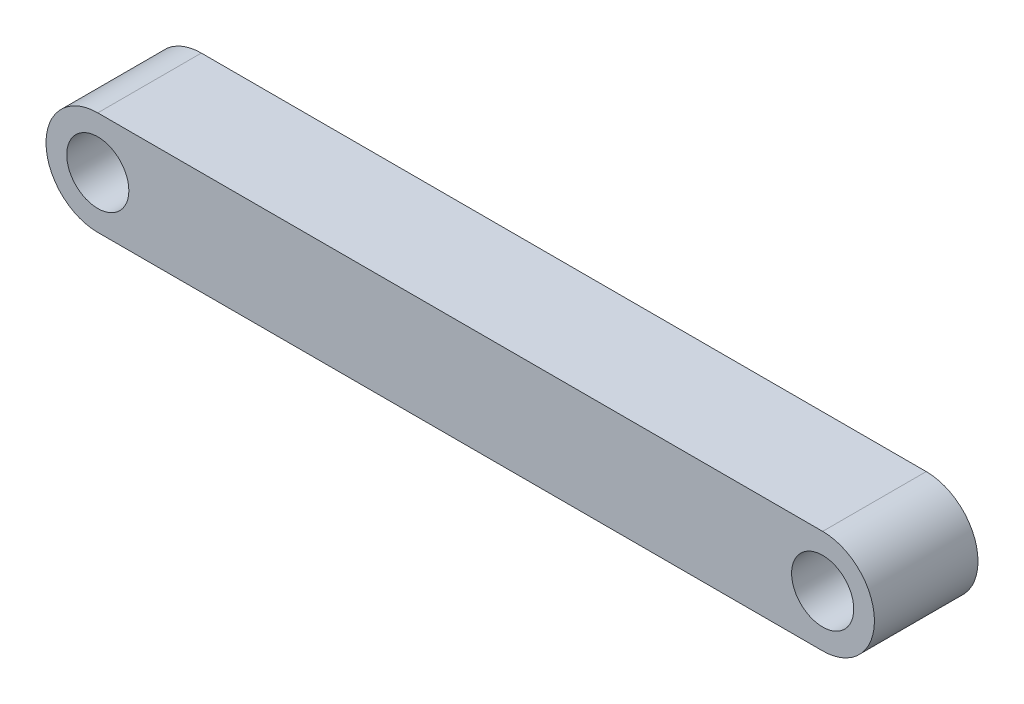
ISO-10303-21;
HEADER;
FILE_DESCRIPTION(('STEP AP214'),'2;1');
FILE_NAME('part.step','',(''),(''),'','','');
FILE_SCHEMA(('AUTOMOTIVE_DESIGN { 1 0 10303 214 1 1 1 1 }'));
ENDSEC;
DATA;
#1=APPLICATION_CONTEXT('core data for automotive mechanical design processes');
#2=APPLICATION_PROTOCOL_DEFINITION('international standard','automotive_design',2000,#1);
#3=PRODUCT_CONTEXT('',#1,'mechanical');
#4=PRODUCT('Part','Part','',(#3));
#5=PRODUCT_RELATED_PRODUCT_CATEGORY('part','',(#4));
#6=PRODUCT_DEFINITION_FORMATION('','',#4);
#7=PRODUCT_DEFINITION_CONTEXT('part definition',#1,'design');
#8=PRODUCT_DEFINITION('design','',#6,#7);
#9=PRODUCT_DEFINITION_SHAPE('','',#8);
#10=(LENGTH_UNIT() NAMED_UNIT(*) SI_UNIT(.MILLI.,.METRE.));
#11=(NAMED_UNIT(*) PLANE_ANGLE_UNIT() SI_UNIT($,.RADIAN.));
#12=(NAMED_UNIT(*) SI_UNIT($,.STERADIAN.) SOLID_ANGLE_UNIT());
#13=UNCERTAINTY_MEASURE_WITH_UNIT(LENGTH_MEASURE(1.E-05),#10,'distance_accuracy_value','');
#14=(GEOMETRIC_REPRESENTATION_CONTEXT(3) GLOBAL_UNCERTAINTY_ASSIGNED_CONTEXT((#13)) GLOBAL_UNIT_ASSIGNED_CONTEXT((#10,
#11,#12)) REPRESENTATION_CONTEXT('',''));
#15=CARTESIAN_POINT('',(0.,0.,0.));
#16=DIRECTION('',(0.,0.,1.));
#17=DIRECTION('',(1.,0.,0.));
#18=AXIS2_PLACEMENT_3D('',#15,#16,#17);
#19=CARTESIAN_POINT('',(-70.,0.,20.));
#20=DIRECTION('',(0.,0.,-1.));
#21=DIRECTION('',(-1.,0.,0.));
#22=AXIS2_PLACEMENT_3D('',#19,#20,#21);
#23=CYLINDRICAL_SURFACE('',#22,10.);
#24=CARTESIAN_POINT('',(-70.,0.,0.));
#25=DIRECTION('',(0.,0.,1.));
#26=DIRECTION('',(1.,0.,0.));
#27=AXIS2_PLACEMENT_3D('',#24,#25,#26);
#28=CIRCLE('',#27,10.);
#29=CARTESIAN_POINT('',(-70.,9.99999999999999,0.));
#30=VERTEX_POINT('',#29);
#31=CARTESIAN_POINT('',(-70.,-10.,0.));
#32=VERTEX_POINT('',#31);
#33=EDGE_CURVE('E99',#30,#32,#28,.T.);
#34=ORIENTED_EDGE('',*,*,#33,.T.);
#35=DIRECTION('',(0.,0.,-1.));
#36=VECTOR('',#35,1.);
#37=CARTESIAN_POINT('',(-70.,-10.,20.));
#38=LINE('',#37,#36);
#39=CARTESIAN_POINT('',(-70.,-10.,20.));
#40=VERTEX_POINT('',#39);
#41=EDGE_CURVE('E11',#40,#32,#38,.T.);
#42=ORIENTED_EDGE('',*,*,#41,.F.);
#43=CARTESIAN_POINT('',(-70.,0.,20.));
#44=DIRECTION('',(0.,0.,1.));
#45=DIRECTION('',(1.,0.,0.));
#46=AXIS2_PLACEMENT_3D('',#43,#44,#45);
#47=CIRCLE('',#46,10.);
#48=CARTESIAN_POINT('',(-70.,9.99999999999999,20.));
#49=VERTEX_POINT('',#48);
#50=EDGE_CURVE('E87',#49,#40,#47,.T.);
#51=ORIENTED_EDGE('',*,*,#50,.F.);
#52=DIRECTION('',(0.,0.,-1.));
#53=VECTOR('',#52,1.);
#54=CARTESIAN_POINT('',(-70.,9.99999999999999,20.));
#55=LINE('',#54,#53);
#56=EDGE_CURVE('E95',#49,#30,#55,.T.);
#57=ORIENTED_EDGE('',*,*,#56,.T.);
#58=EDGE_LOOP('',(#34,#42,#51,#57));
#59=FACE_BOUND('',#58,.T.);
#60=ADVANCED_FACE('F36',(#59),#23,.T.);
#61=CARTESIAN_POINT('',(70.,-9.99999999999999,20.));
#62=DIRECTION('',(0.,1.,0.));
#63=DIRECTION('',(-1.,0.,0.));
#64=AXIS2_PLACEMENT_3D('',#61,#62,#63);
#65=PLANE('',#64);
#66=DIRECTION('',(1.,0.,0.));
#67=VECTOR('',#66,1.);
#68=CARTESIAN_POINT('',(70.,-9.99999999999999,0.));
#69=LINE('',#68,#67);
#70=CARTESIAN_POINT('',(70.,-9.99999999999999,0.));
#71=VERTEX_POINT('',#70);
#72=EDGE_CURVE('E91',#32,#71,#69,.T.);
#73=ORIENTED_EDGE('',*,*,#72,.T.);
#74=DIRECTION('',(0.,0.,-1.));
#75=VECTOR('',#74,1.);
#76=CARTESIAN_POINT('',(70.,-9.99999999999999,20.));
#77=LINE('',#76,#75);
#78=CARTESIAN_POINT('',(70.,-9.99999999999999,20.));
#79=VERTEX_POINT('',#78);
#80=EDGE_CURVE('E44',#79,#71,#77,.T.);
#81=ORIENTED_EDGE('',*,*,#80,.F.);
#82=DIRECTION('',(1.,0.,0.));
#83=VECTOR('',#82,1.);
#84=CARTESIAN_POINT('',(70.,-9.99999999999999,20.));
#85=LINE('',#84,#83);
#86=EDGE_CURVE('E82',#40,#79,#85,.T.);
#87=ORIENTED_EDGE('',*,*,#86,.F.);
#88=ORIENTED_EDGE('',*,*,#41,.T.);
#89=EDGE_LOOP('',(#73,#81,#87,#88));
#90=FACE_BOUND('',#89,.T.);
#91=ADVANCED_FACE('F90',(#90),#65,.F.);
#92=CARTESIAN_POINT('',(70.,0.,20.));
#93=DIRECTION('',(0.,0.,-1.));
#94=DIRECTION('',(-1.,0.,0.));
#95=AXIS2_PLACEMENT_3D('',#92,#93,#94);
#96=CYLINDRICAL_SURFACE('',#95,10.);
#97=CARTESIAN_POINT('',(70.,0.,0.));
#98=DIRECTION('',(0.,0.,1.));
#99=DIRECTION('',(-1.,0.,0.));
#100=AXIS2_PLACEMENT_3D('',#97,#98,#99);
#101=CIRCLE('',#100,10.);
#102=CARTESIAN_POINT('',(70.,10.,0.));
#103=VERTEX_POINT('',#102);
#104=EDGE_CURVE('E69',#71,#103,#101,.T.);
#105=ORIENTED_EDGE('',*,*,#104,.T.);
#106=DIRECTION('',(0.,0.,-1.));
#107=VECTOR('',#106,1.);
#108=CARTESIAN_POINT('',(70.,10.,20.));
#109=LINE('',#108,#107);
#110=CARTESIAN_POINT('',(70.,10.,20.));
#111=VERTEX_POINT('',#110);
#112=EDGE_CURVE('E92',#111,#103,#109,.T.);
#113=ORIENTED_EDGE('',*,*,#112,.F.);
#114=CARTESIAN_POINT('',(70.,0.,20.));
#115=DIRECTION('',(0.,0.,1.));
#116=DIRECTION('',(-1.,0.,0.));
#117=AXIS2_PLACEMENT_3D('',#114,#115,#116);
#118=CIRCLE('',#117,10.);
#119=EDGE_CURVE('E85',#79,#111,#118,.T.);
#120=ORIENTED_EDGE('',*,*,#119,.F.);
#121=ORIENTED_EDGE('',*,*,#80,.T.);
#122=EDGE_LOOP('',(#105,#113,#120,#121));
#123=FACE_BOUND('',#122,.T.);
#124=ADVANCED_FACE('F93',(#123),#96,.T.);
#125=CARTESIAN_POINT('',(70.,10.,20.));
#126=DIRECTION('',(0.,-1.,0.));
#127=DIRECTION('',(1.,0.,0.));
#128=AXIS2_PLACEMENT_3D('',#125,#126,#127);
#129=PLANE('',#128);
#130=DIRECTION('',(-1.,0.,0.));
#131=VECTOR('',#130,1.);
#132=CARTESIAN_POINT('',(70.,10.,0.));
#133=LINE('',#132,#131);
#134=EDGE_CURVE('E75',#103,#30,#133,.T.);
#135=ORIENTED_EDGE('',*,*,#134,.T.);
#136=ORIENTED_EDGE('',*,*,#56,.F.);
#137=DIRECTION('',(-1.,0.,0.));
#138=VECTOR('',#137,1.);
#139=CARTESIAN_POINT('',(70.,10.,20.));
#140=LINE('',#139,#138);
#141=EDGE_CURVE('E52',#111,#49,#140,.T.);
#142=ORIENTED_EDGE('',*,*,#141,.F.);
#143=ORIENTED_EDGE('',*,*,#112,.T.);
#144=EDGE_LOOP('',(#135,#136,#142,#143));
#145=FACE_BOUND('',#144,.T.);
#146=ADVANCED_FACE('F107',(#145),#129,.F.);
#147=CARTESIAN_POINT('',(-70.,0.,20.));
#148=DIRECTION('',(0.,0.,1.));
#149=DIRECTION('',(1.,0.,0.));
#150=AXIS2_PLACEMENT_3D('',#147,#148,#149);
#151=PLANE('',#150);
#152=CARTESIAN_POINT('',(-70.,0.,20.));
#153=DIRECTION('',(0.,0.,1.));
#154=DIRECTION('',(1.,0.,0.));
#155=AXIS2_PLACEMENT_3D('',#152,#153,#154);
#156=CIRCLE('',#155,6.);
#157=CARTESIAN_POINT('',(-64.,0.,20.));
#158=VERTEX_POINT('',#157);
#159=EDGE_CURVE('E119',#158,#158,#156,.T.);
#160=ORIENTED_EDGE('',*,*,#159,.F.);
#161=EDGE_LOOP('',(#160));
#162=FACE_BOUND('',#161,.T.);
#163=CARTESIAN_POINT('',(70.,0.,20.));
#164=DIRECTION('',(0.,0.,1.));
#165=DIRECTION('',(1.,0.,0.));
#166=AXIS2_PLACEMENT_3D('',#163,#164,#165);
#167=CIRCLE('',#166,6.);
#168=CARTESIAN_POINT('',(76.,0.,20.));
#169=VERTEX_POINT('',#168);
#170=EDGE_CURVE('E113',#169,#169,#167,.T.);
#171=ORIENTED_EDGE('',*,*,#170,.F.);
#172=EDGE_LOOP('',(#171));
#173=FACE_BOUND('',#172,.T.);
#174=ORIENTED_EDGE('',*,*,#50,.T.);
#175=ORIENTED_EDGE('',*,*,#86,.T.);
#176=ORIENTED_EDGE('',*,*,#119,.T.);
#177=ORIENTED_EDGE('',*,*,#141,.T.);
#178=EDGE_LOOP('',(#174,#175,#176,#177));
#179=FACE_BOUND('',#178,.T.);
#180=ADVANCED_FACE('F83',(#162,#173,#179),#151,.T.);
#181=CARTESIAN_POINT('',(-70.,0.,0.));
#182=DIRECTION('',(0.,0.,1.));
#183=DIRECTION('',(1.,0.,0.));
#184=AXIS2_PLACEMENT_3D('',#181,#182,#183);
#185=PLANE('',#184);
#186=CARTESIAN_POINT('',(-70.,0.,0.));
#187=DIRECTION('',(0.,0.,1.));
#188=DIRECTION('',(1.,0.,0.));
#189=AXIS2_PLACEMENT_3D('',#186,#187,#188);
#190=CIRCLE('',#189,6.);
#191=CARTESIAN_POINT('',(-64.,0.,0.));
#192=VERTEX_POINT('',#191);
#193=EDGE_CURVE('E102',#192,#192,#190,.T.);
#194=ORIENTED_EDGE('',*,*,#193,.T.);
#195=EDGE_LOOP('',(#194));
#196=FACE_BOUND('',#195,.T.);
#197=CARTESIAN_POINT('',(70.,0.,0.));
#198=DIRECTION('',(0.,0.,1.));
#199=DIRECTION('',(1.,0.,0.));
#200=AXIS2_PLACEMENT_3D('',#197,#198,#199);
#201=CIRCLE('',#200,6.);
#202=CARTESIAN_POINT('',(76.,0.,0.));
#203=VERTEX_POINT('',#202);
#204=EDGE_CURVE('E116',#203,#203,#201,.T.);
#205=ORIENTED_EDGE('',*,*,#204,.T.);
#206=EDGE_LOOP('',(#205));
#207=FACE_BOUND('',#206,.T.);
#208=ORIENTED_EDGE('',*,*,#33,.F.);
#209=ORIENTED_EDGE('',*,*,#134,.F.);
#210=ORIENTED_EDGE('',*,*,#104,.F.);
#211=ORIENTED_EDGE('',*,*,#72,.F.);
#212=EDGE_LOOP('',(#208,#209,#210,#211));
#213=FACE_BOUND('',#212,.T.);
#214=ADVANCED_FACE('F110',(#196,#207,#213),#185,.F.);
#215=CARTESIAN_POINT('',(70.,0.,0.));
#216=DIRECTION('',(0.,0.,1.));
#217=DIRECTION('',(1.,0.,0.));
#218=AXIS2_PLACEMENT_3D('',#215,#216,#217);
#219=CYLINDRICAL_SURFACE('',#218,6.);
#220=ORIENTED_EDGE('',*,*,#204,.F.);
#221=EDGE_LOOP('',(#220));
#222=FACE_BOUND('',#221,.T.);
#223=ORIENTED_EDGE('',*,*,#170,.T.);
#224=EDGE_LOOP('',(#223));
#225=FACE_BOUND('',#224,.T.);
#226=ADVANCED_FACE('F130',(#222,#225),#219,.F.);
#227=CARTESIAN_POINT('',(-70.,0.,0.));
#228=DIRECTION('',(0.,0.,1.));
#229=DIRECTION('',(1.,0.,0.));
#230=AXIS2_PLACEMENT_3D('',#227,#228,#229);
#231=CYLINDRICAL_SURFACE('',#230,6.);
#232=ORIENTED_EDGE('',*,*,#193,.F.);
#233=EDGE_LOOP('',(#232));
#234=FACE_BOUND('',#233,.T.);
#235=ORIENTED_EDGE('',*,*,#159,.T.);
#236=EDGE_LOOP('',(#235));
#237=FACE_BOUND('',#236,.T.);
#238=ADVANCED_FACE('F127',(#234,#237),#231,.F.);
#239=CLOSED_SHELL('',(#60,#91,#124,#146,#180,#214,#226,#238));
#240=MANIFOLD_SOLID_BREP('B2',#239);
#241=ADVANCED_BREP_SHAPE_REPRESENTATION('',(#18,#240),#14);
#242=SHAPE_DEFINITION_REPRESENTATION(#9,#241);
ENDSEC;
END-ISO-10303-21;
